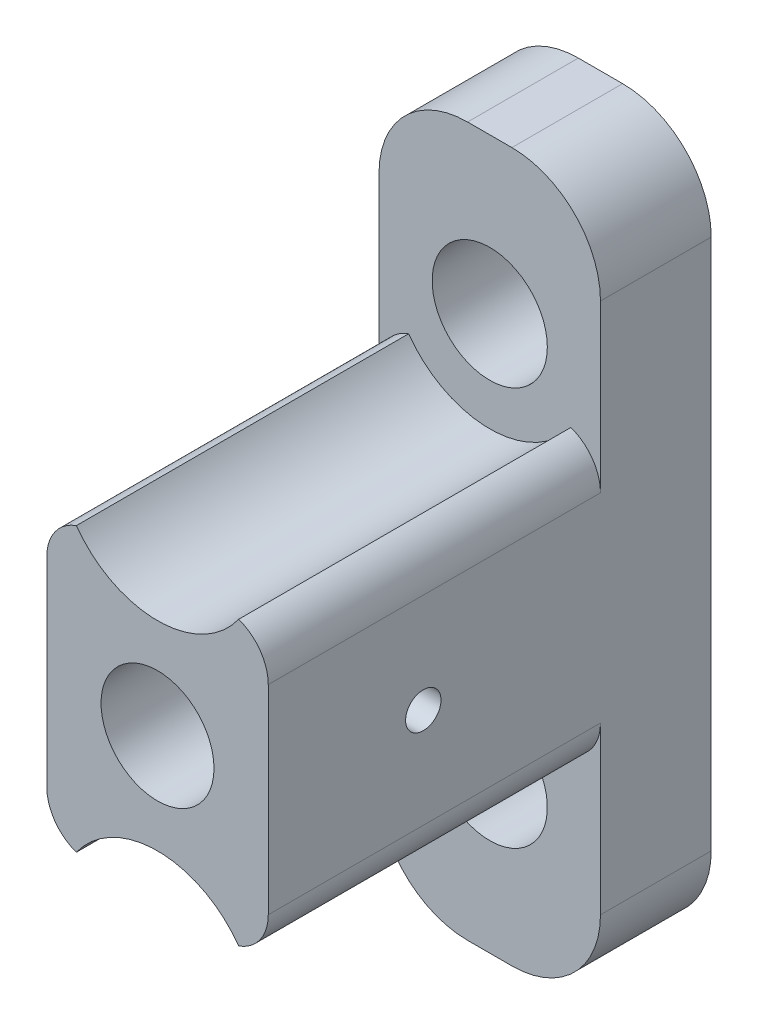
ISO-10303-21;
HEADER;
FILE_DESCRIPTION(('STEP AP214'),'2;1');
FILE_NAME('part.step','',(''),(''),'','','');
FILE_SCHEMA(('AUTOMOTIVE_DESIGN { 1 0 10303 214 1 1 1 1 }'));
ENDSEC;
DATA;
#1=APPLICATION_CONTEXT('core data for automotive mechanical design processes');
#2=APPLICATION_PROTOCOL_DEFINITION('international standard','automotive_design',2000,#1);
#3=PRODUCT_CONTEXT('',#1,'mechanical');
#4=PRODUCT('Part','Part','',(#3));
#5=PRODUCT_RELATED_PRODUCT_CATEGORY('part','',(#4));
#6=PRODUCT_DEFINITION_FORMATION('','',#4);
#7=PRODUCT_DEFINITION_CONTEXT('part definition',#1,'design');
#8=PRODUCT_DEFINITION('design','',#6,#7);
#9=PRODUCT_DEFINITION_SHAPE('','',#8);
#10=(LENGTH_UNIT() NAMED_UNIT(*) SI_UNIT(.MILLI.,.METRE.));
#11=(NAMED_UNIT(*) PLANE_ANGLE_UNIT() SI_UNIT($,.RADIAN.));
#12=(NAMED_UNIT(*) SI_UNIT($,.STERADIAN.) SOLID_ANGLE_UNIT());
#13=UNCERTAINTY_MEASURE_WITH_UNIT(LENGTH_MEASURE(1.E-05),#10,'distance_accuracy_value','');
#14=(GEOMETRIC_REPRESENTATION_CONTEXT(3) GLOBAL_UNCERTAINTY_ASSIGNED_CONTEXT((#13)) GLOBAL_UNIT_ASSIGNED_CONTEXT((#10,
#11,#12)) REPRESENTATION_CONTEXT('',''));
#15=CARTESIAN_POINT('',(0.,0.,0.));
#16=DIRECTION('',(0.,0.,1.));
#17=DIRECTION('',(1.,0.,0.));
#18=AXIS2_PLACEMENT_3D('',#15,#16,#17);
#19=CARTESIAN_POINT('',(-1.,12.,0.));
#20=DIRECTION('',(0.,0.,-1.));
#21=DIRECTION('',(-1.,0.,0.));
#22=AXIS2_PLACEMENT_3D('',#19,#20,#21);
#23=PLANE('',#22);
#24=CARTESIAN_POINT('',(3.00000000000001,-4.5,0.));
#25=DIRECTION('',(0.,0.,-1.));
#26=DIRECTION('',(-1.,0.,0.));
#27=AXIS2_PLACEMENT_3D('',#24,#25,#26);
#28=CIRCLE('',#27,2.);
#29=CARTESIAN_POINT('',(5.00000000000001,-4.5,0.));
#30=VERTEX_POINT('',#29);
#31=CARTESIAN_POINT('',(3.66345767685569,-6.38674956234824,0.));
#32=VERTEX_POINT('',#31);
#33=EDGE_CURVE('E193',#30,#32,#28,.T.);
#34=ORIENTED_EDGE('',*,*,#33,.T.);
#35=CARTESIAN_POINT('',(0.,-9.,0.));
#36=DIRECTION('',(0.,0.,-1.));
#37=DIRECTION('',(-1.,0.,0.));
#38=AXIS2_PLACEMENT_3D('',#35,#36,#37);
#39=CIRCLE('',#38,4.5);
#40=CARTESIAN_POINT('',(-3.66345767685568,-6.38674956234823,0.));
#41=VERTEX_POINT('',#40);
#42=EDGE_CURVE('E172',#32,#41,#39,.F.);
#43=ORIENTED_EDGE('',*,*,#42,.T.);
#44=CARTESIAN_POINT('',(-3.,-4.5,0.));
#45=DIRECTION('',(0.,0.,-1.));
#46=DIRECTION('',(-1.,0.,0.));
#47=AXIS2_PLACEMENT_3D('',#44,#45,#46);
#48=CIRCLE('',#47,2.);
#49=CARTESIAN_POINT('',(-5.,-4.5,0.));
#50=VERTEX_POINT('',#49);
#51=EDGE_CURVE('E196',#41,#50,#48,.T.);
#52=ORIENTED_EDGE('',*,*,#51,.T.);
#53=DIRECTION('',(0.,-1.,0.));
#54=VECTOR('',#53,1.);
#55=CARTESIAN_POINT('',(-5.,-12.,0.));
#56=LINE('',#55,#54);
#57=CARTESIAN_POINT('',(-5.,-12.,0.));
#58=VERTEX_POINT('',#57);
#59=EDGE_CURVE('E297',#50,#58,#56,.T.);
#60=ORIENTED_EDGE('',*,*,#59,.T.);
#61=CARTESIAN_POINT('',(-1.,-12.,0.));
#62=DIRECTION('',(0.,0.,1.));
#63=DIRECTION('',(1.,0.,0.));
#64=AXIS2_PLACEMENT_3D('',#61,#62,#63);
#65=CIRCLE('',#64,4.);
#66=CARTESIAN_POINT('',(-0.999999999999997,-16.,0.));
#67=VERTEX_POINT('',#66);
#68=EDGE_CURVE('E300',#58,#67,#65,.T.);
#69=ORIENTED_EDGE('',*,*,#68,.T.);
#70=DIRECTION('',(1.,0.,0.));
#71=VECTOR('',#70,1.);
#72=CARTESIAN_POINT('',(-0.999999999999997,-16.,0.));
#73=LINE('',#72,#71);
#74=CARTESIAN_POINT('',(1.,-16.,0.));
#75=VERTEX_POINT('',#74);
#76=EDGE_CURVE('E303',#67,#75,#73,.T.);
#77=ORIENTED_EDGE('',*,*,#76,.T.);
#78=CARTESIAN_POINT('',(1.00000000000001,-12.,0.));
#79=DIRECTION('',(0.,0.,1.));
#80=DIRECTION('',(-1.,0.,0.));
#81=AXIS2_PLACEMENT_3D('',#78,#79,#80);
#82=CIRCLE('',#81,4.);
#83=CARTESIAN_POINT('',(5.00000000000001,-12.,0.));
#84=VERTEX_POINT('',#83);
#85=EDGE_CURVE('E306',#75,#84,#82,.T.);
#86=ORIENTED_EDGE('',*,*,#85,.T.);
#87=DIRECTION('',(0.,1.,0.));
#88=VECTOR('',#87,1.);
#89=CARTESIAN_POINT('',(5.00000000000001,-12.,0.));
#90=LINE('',#89,#88);
#91=EDGE_CURVE('E310',#84,#30,#90,.T.);
#92=ORIENTED_EDGE('',*,*,#91,.T.);
#93=EDGE_LOOP('',(#34,#43,#52,#60,#69,#77,#86,#92));
#94=FACE_BOUND('',#93,.T.);
#95=CARTESIAN_POINT('',(0.,-9.,0.));
#96=DIRECTION('',(0.,0.,1.));
#97=DIRECTION('',(-1.,0.,0.));
#98=AXIS2_PLACEMENT_3D('',#95,#96,#97);
#99=CIRCLE('',#98,2.6);
#100=CARTESIAN_POINT('',(-2.6,-9.,0.));
#101=VERTEX_POINT('',#100);
#102=EDGE_CURVE('E265',#101,#101,#99,.T.);
#103=ORIENTED_EDGE('',*,*,#102,.F.);
#104=EDGE_LOOP('',(#103));
#105=FACE_BOUND('',#104,.T.);
#106=ADVANCED_FACE('F36',(#94,#105),#23,.F.);
#107=CARTESIAN_POINT('',(-1.,12.,-5.));
#108=DIRECTION('',(0.,0.,1.));
#109=DIRECTION('',(1.,0.,0.));
#110=AXIS2_PLACEMENT_3D('',#107,#108,#109);
#111=CYLINDRICAL_SURFACE('',#110,4.);
#112=CARTESIAN_POINT('',(-1.,12.,0.));
#113=DIRECTION('',(0.,0.,1.));
#114=DIRECTION('',(-1.,0.,0.));
#115=AXIS2_PLACEMENT_3D('',#112,#113,#114);
#116=CIRCLE('',#115,4.);
#117=CARTESIAN_POINT('',(-0.999999999999997,16.,0.));
#118=VERTEX_POINT('',#117);
#119=CARTESIAN_POINT('',(-5.,12.,0.));
#120=VERTEX_POINT('',#119);
#121=EDGE_CURVE('E262',#118,#120,#116,.T.);
#122=ORIENTED_EDGE('',*,*,#121,.F.);
#123=DIRECTION('',(0.,0.,1.));
#124=VECTOR('',#123,1.);
#125=CARTESIAN_POINT('',(-0.999999999999997,16.,-5.));
#126=LINE('',#125,#124);
#127=CARTESIAN_POINT('',(-0.999999999999997,16.,-5.));
#128=VERTEX_POINT('',#127);
#129=EDGE_CURVE('E317',#128,#118,#126,.T.);
#130=ORIENTED_EDGE('',*,*,#129,.F.);
#131=CARTESIAN_POINT('',(-1.,12.,-5.));
#132=DIRECTION('',(0.,0.,1.));
#133=DIRECTION('',(-1.,0.,0.));
#134=AXIS2_PLACEMENT_3D('',#131,#132,#133);
#135=CIRCLE('',#134,4.);
#136=CARTESIAN_POINT('',(-5.,12.,-5.));
#137=VERTEX_POINT('',#136);
#138=EDGE_CURVE('E269',#128,#137,#135,.T.);
#139=ORIENTED_EDGE('',*,*,#138,.T.);
#140=DIRECTION('',(0.,0.,1.));
#141=VECTOR('',#140,1.);
#142=CARTESIAN_POINT('',(-5.,12.,-5.));
#143=LINE('',#142,#141);
#144=EDGE_CURVE('E294',#137,#120,#143,.T.);
#145=ORIENTED_EDGE('',*,*,#144,.T.);
#146=EDGE_LOOP('',(#122,#130,#139,#145));
#147=FACE_BOUND('',#146,.T.);
#148=ADVANCED_FACE('F223',(#147),#111,.T.);
#149=CARTESIAN_POINT('',(-0.999999999999997,16.,-5.));
#150=DIRECTION('',(0.,1.,0.));
#151=DIRECTION('',(0.,0.,1.));
#152=AXIS2_PLACEMENT_3D('',#149,#150,#151);
#153=PLANE('',#152);
#154=DIRECTION('',(-1.,0.,0.));
#155=VECTOR('',#154,1.);
#156=CARTESIAN_POINT('',(-0.999999999999997,16.,0.));
#157=LINE('',#156,#155);
#158=CARTESIAN_POINT('',(1.,16.,0.));
#159=VERTEX_POINT('',#158);
#160=EDGE_CURVE('E273',#159,#118,#157,.T.);
#161=ORIENTED_EDGE('',*,*,#160,.F.);
#162=DIRECTION('',(0.,0.,1.));
#163=VECTOR('',#162,1.);
#164=CARTESIAN_POINT('',(1.,16.,-5.));
#165=LINE('',#164,#163);
#166=CARTESIAN_POINT('',(1.,16.,-5.));
#167=VERTEX_POINT('',#166);
#168=EDGE_CURVE('E319',#167,#159,#165,.T.);
#169=ORIENTED_EDGE('',*,*,#168,.F.);
#170=DIRECTION('',(-1.,0.,0.));
#171=VECTOR('',#170,1.);
#172=CARTESIAN_POINT('',(-0.999999999999997,16.,-5.));
#173=LINE('',#172,#171);
#174=EDGE_CURVE('E291',#167,#128,#173,.T.);
#175=ORIENTED_EDGE('',*,*,#174,.T.);
#176=ORIENTED_EDGE('',*,*,#129,.T.);
#177=EDGE_LOOP('',(#161,#169,#175,#176));
#178=FACE_BOUND('',#177,.T.);
#179=ADVANCED_FACE('F231',(#178),#153,.T.);
#180=CARTESIAN_POINT('',(1.,12.,-5.));
#181=DIRECTION('',(0.,0.,1.));
#182=DIRECTION('',(1.,0.,0.));
#183=AXIS2_PLACEMENT_3D('',#180,#181,#182);
#184=CYLINDRICAL_SURFACE('',#183,4.);
#185=CARTESIAN_POINT('',(1.,12.,0.));
#186=DIRECTION('',(0.,0.,1.));
#187=DIRECTION('',(1.,0.,0.));
#188=AXIS2_PLACEMENT_3D('',#185,#186,#187);
#189=CIRCLE('',#188,4.);
#190=CARTESIAN_POINT('',(5.00000000000001,12.,0.));
#191=VERTEX_POINT('',#190);
#192=EDGE_CURVE('E312',#191,#159,#189,.T.);
#193=ORIENTED_EDGE('',*,*,#192,.F.);
#194=DIRECTION('',(0.,0.,1.));
#195=VECTOR('',#194,1.);
#196=CARTESIAN_POINT('',(5.00000000000001,12.,-5.));
#197=LINE('',#196,#195);
#198=CARTESIAN_POINT('',(5.00000000000001,12.,-5.));
#199=VERTEX_POINT('',#198);
#200=EDGE_CURVE('E321',#199,#191,#197,.T.);
#201=ORIENTED_EDGE('',*,*,#200,.F.);
#202=CARTESIAN_POINT('',(1.,12.,-5.));
#203=DIRECTION('',(0.,0.,1.));
#204=DIRECTION('',(1.,0.,0.));
#205=AXIS2_PLACEMENT_3D('',#202,#203,#204);
#206=CIRCLE('',#205,4.);
#207=EDGE_CURVE('E288',#199,#167,#206,.T.);
#208=ORIENTED_EDGE('',*,*,#207,.T.);
#209=ORIENTED_EDGE('',*,*,#168,.T.);
#210=EDGE_LOOP('',(#193,#201,#208,#209));
#211=FACE_BOUND('',#210,.T.);
#212=ADVANCED_FACE('F383',(#211),#184,.T.);
#213=CARTESIAN_POINT('',(5.00000000000001,-12.,-5.));
#214=DIRECTION('',(1.,0.,0.));
#215=DIRECTION('',(0.,0.,-1.));
#216=AXIS2_PLACEMENT_3D('',#213,#214,#215);
#217=PLANE('',#216);
#218=CARTESIAN_POINT('',(5.00000000000001,0.,8.));
#219=DIRECTION('',(1.,0.,0.));
#220=DIRECTION('',(0.,0.,-1.));
#221=AXIS2_PLACEMENT_3D('',#218,#219,#220);
#222=CIRCLE('',#221,0.800000000000001);
#223=CARTESIAN_POINT('',(5.00000000000001,0.,7.2));
#224=VERTEX_POINT('',#223);
#225=EDGE_CURVE('E408',#224,#224,#222,.T.);
#226=ORIENTED_EDGE('',*,*,#225,.F.);
#227=EDGE_LOOP('',(#226));
#228=FACE_BOUND('',#227,.T.);
#229=DIRECTION('',(0.,1.,0.));
#230=VECTOR('',#229,1.);
#231=CARTESIAN_POINT('',(5.00000000000001,-6.5,15.));
#232=LINE('',#231,#230);
#233=CARTESIAN_POINT('',(5.00000000000001,-4.5,15.));
#234=VERTEX_POINT('',#233);
#235=CARTESIAN_POINT('',(5.00000000000001,4.5,15.));
#236=VERTEX_POINT('',#235);
#237=EDGE_CURVE('E338',#234,#236,#232,.T.);
#238=ORIENTED_EDGE('',*,*,#237,.F.);
#239=DIRECTION('',(0.,0.,-1.));
#240=VECTOR('',#239,1.);
#241=CARTESIAN_POINT('',(5.00000000000001,-4.5,0.));
#242=LINE('',#241,#240);
#243=EDGE_CURVE('E177',#234,#30,#242,.T.);
#244=ORIENTED_EDGE('',*,*,#243,.T.);
#245=ORIENTED_EDGE('',*,*,#91,.F.);
#246=DIRECTION('',(0.,0.,1.));
#247=VECTOR('',#246,1.);
#248=CARTESIAN_POINT('',(5.00000000000001,-12.,-5.));
#249=LINE('',#248,#247);
#250=CARTESIAN_POINT('',(5.00000000000001,-12.,-5.));
#251=VERTEX_POINT('',#250);
#252=EDGE_CURVE('E324',#251,#84,#249,.T.);
#253=ORIENTED_EDGE('',*,*,#252,.F.);
#254=DIRECTION('',(0.,1.,0.));
#255=VECTOR('',#254,1.);
#256=CARTESIAN_POINT('',(5.00000000000001,-12.,-5.));
#257=LINE('',#256,#255);
#258=EDGE_CURVE('E285',#251,#199,#257,.T.);
#259=ORIENTED_EDGE('',*,*,#258,.T.);
#260=ORIENTED_EDGE('',*,*,#200,.T.);
#261=CARTESIAN_POINT('',(5.00000000000001,4.5,0.));
#262=VERTEX_POINT('',#261);
#263=EDGE_CURVE('E309',#262,#191,#90,.T.);
#264=ORIENTED_EDGE('',*,*,#263,.F.);
#265=DIRECTION('',(0.,0.,-1.));
#266=VECTOR('',#265,1.);
#267=CARTESIAN_POINT('',(5.00000000000001,4.5,15.));
#268=LINE('',#267,#266);
#269=EDGE_CURVE('E182',#262,#236,#268,.F.);
#270=ORIENTED_EDGE('',*,*,#269,.T.);
#271=EDGE_LOOP('',(#238,#244,#245,#253,#259,#260,#264,#270));
#272=FACE_BOUND('',#271,.T.);
#273=ADVANCED_FACE('F337',(#228,#272),#217,.T.);
#274=CARTESIAN_POINT('',(1.00000000000001,-12.,-5.));
#275=DIRECTION('',(0.,0.,1.));
#276=DIRECTION('',(1.,0.,0.));
#277=AXIS2_PLACEMENT_3D('',#274,#275,#276);
#278=CYLINDRICAL_SURFACE('',#277,4.);
#279=ORIENTED_EDGE('',*,*,#85,.F.);
#280=DIRECTION('',(0.,0.,1.));
#281=VECTOR('',#280,1.);
#282=CARTESIAN_POINT('',(1.,-16.,-5.));
#283=LINE('',#282,#281);
#284=CARTESIAN_POINT('',(1.,-16.,-5.));
#285=VERTEX_POINT('',#284);
#286=EDGE_CURVE('E326',#285,#75,#283,.T.);
#287=ORIENTED_EDGE('',*,*,#286,.F.);
#288=CARTESIAN_POINT('',(1.00000000000001,-12.,-5.));
#289=DIRECTION('',(0.,0.,1.));
#290=DIRECTION('',(-1.,0.,0.));
#291=AXIS2_PLACEMENT_3D('',#288,#289,#290);
#292=CIRCLE('',#291,4.);
#293=EDGE_CURVE('E282',#285,#251,#292,.T.);
#294=ORIENTED_EDGE('',*,*,#293,.T.);
#295=ORIENTED_EDGE('',*,*,#252,.T.);
#296=EDGE_LOOP('',(#279,#287,#294,#295));
#297=FACE_BOUND('',#296,.T.);
#298=ADVANCED_FACE('F389',(#297),#278,.T.);
#299=CARTESIAN_POINT('',(-0.999999999999997,-16.,-5.));
#300=DIRECTION('',(0.,-1.,0.));
#301=DIRECTION('',(0.,0.,-1.));
#302=AXIS2_PLACEMENT_3D('',#299,#300,#301);
#303=PLANE('',#302);
#304=ORIENTED_EDGE('',*,*,#76,.F.);
#305=DIRECTION('',(0.,0.,1.));
#306=VECTOR('',#305,1.);
#307=CARTESIAN_POINT('',(-0.999999999999997,-16.,-5.));
#308=LINE('',#307,#306);
#309=CARTESIAN_POINT('',(-0.999999999999997,-16.,-5.));
#310=VERTEX_POINT('',#309);
#311=EDGE_CURVE('E328',#310,#67,#308,.T.);
#312=ORIENTED_EDGE('',*,*,#311,.F.);
#313=DIRECTION('',(1.,0.,0.));
#314=VECTOR('',#313,1.);
#315=CARTESIAN_POINT('',(-0.999999999999997,-16.,-5.));
#316=LINE('',#315,#314);
#317=EDGE_CURVE('E279',#310,#285,#316,.T.);
#318=ORIENTED_EDGE('',*,*,#317,.T.);
#319=ORIENTED_EDGE('',*,*,#286,.T.);
#320=EDGE_LOOP('',(#304,#312,#318,#319));
#321=FACE_BOUND('',#320,.T.);
#322=ADVANCED_FACE('F393',(#321),#303,.T.);
#323=CARTESIAN_POINT('',(-1.,-12.,-5.));
#324=DIRECTION('',(0.,0.,1.));
#325=DIRECTION('',(1.,0.,0.));
#326=AXIS2_PLACEMENT_3D('',#323,#324,#325);
#327=CYLINDRICAL_SURFACE('',#326,4.);
#328=ORIENTED_EDGE('',*,*,#68,.F.);
#329=DIRECTION('',(0.,0.,1.));
#330=VECTOR('',#329,1.);
#331=CARTESIAN_POINT('',(-5.,-12.,-5.));
#332=LINE('',#331,#330);
#333=CARTESIAN_POINT('',(-5.,-12.,-5.));
#334=VERTEX_POINT('',#333);
#335=EDGE_CURVE('E330',#334,#58,#332,.T.);
#336=ORIENTED_EDGE('',*,*,#335,.F.);
#337=CARTESIAN_POINT('',(-1.,-12.,-5.));
#338=DIRECTION('',(0.,0.,1.));
#339=DIRECTION('',(1.,0.,0.));
#340=AXIS2_PLACEMENT_3D('',#337,#338,#339);
#341=CIRCLE('',#340,4.);
#342=EDGE_CURVE('E276',#334,#310,#341,.T.);
#343=ORIENTED_EDGE('',*,*,#342,.T.);
#344=ORIENTED_EDGE('',*,*,#311,.T.);
#345=EDGE_LOOP('',(#328,#336,#343,#344));
#346=FACE_BOUND('',#345,.T.);
#347=ADVANCED_FACE('F396',(#346),#327,.T.);
#348=CARTESIAN_POINT('',(-5.,-12.,-5.));
#349=DIRECTION('',(-1.,0.,0.));
#350=DIRECTION('',(0.,0.,1.));
#351=AXIS2_PLACEMENT_3D('',#348,#349,#350);
#352=PLANE('',#351);
#353=CARTESIAN_POINT('',(-5.00000000000001,0.,8.));
#354=DIRECTION('',(1.,0.,0.));
#355=DIRECTION('',(0.,0.,-1.));
#356=AXIS2_PLACEMENT_3D('',#353,#354,#355);
#357=CIRCLE('',#356,0.800000000000001);
#358=CARTESIAN_POINT('',(-5.00000000000001,0.,7.2));
#359=VERTEX_POINT('',#358);
#360=EDGE_CURVE('E205',#359,#359,#357,.T.);
#361=ORIENTED_EDGE('',*,*,#360,.T.);
#362=EDGE_LOOP('',(#361));
#363=FACE_BOUND('',#362,.T.);
#364=ORIENTED_EDGE('',*,*,#59,.F.);
#365=DIRECTION('',(0.,0.,-1.));
#366=VECTOR('',#365,1.);
#367=CARTESIAN_POINT('',(-5.,-4.5,15.));
#368=LINE('',#367,#366);
#369=CARTESIAN_POINT('',(-5.00000000000001,-4.5,15.));
#370=VERTEX_POINT('',#369);
#371=EDGE_CURVE('E191',#50,#370,#368,.F.);
#372=ORIENTED_EDGE('',*,*,#371,.T.);
#373=DIRECTION('',(0.,-1.,0.));
#374=VECTOR('',#373,1.);
#375=CARTESIAN_POINT('',(-5.00000000000001,-6.5,15.));
#376=LINE('',#375,#374);
#377=CARTESIAN_POINT('',(-5.00000000000001,4.5,15.));
#378=VERTEX_POINT('',#377);
#379=EDGE_CURVE('E343',#378,#370,#376,.T.);
#380=ORIENTED_EDGE('',*,*,#379,.F.);
#381=DIRECTION('',(0.,0.,-1.));
#382=VECTOR('',#381,1.);
#383=CARTESIAN_POINT('',(-5.,4.5,0.));
#384=LINE('',#383,#382);
#385=CARTESIAN_POINT('',(-5.,4.5,0.));
#386=VERTEX_POINT('',#385);
#387=EDGE_CURVE('E176',#378,#386,#384,.T.);
#388=ORIENTED_EDGE('',*,*,#387,.T.);
#389=EDGE_CURVE('E298',#120,#386,#56,.T.);
#390=ORIENTED_EDGE('',*,*,#389,.F.);
#391=ORIENTED_EDGE('',*,*,#144,.F.);
#392=DIRECTION('',(0.,-1.,0.));
#393=VECTOR('',#392,1.);
#394=CARTESIAN_POINT('',(-5.,-12.,-5.));
#395=LINE('',#394,#393);
#396=EDGE_CURVE('E272',#137,#334,#395,.T.);
#397=ORIENTED_EDGE('',*,*,#396,.T.);
#398=ORIENTED_EDGE('',*,*,#335,.T.);
#399=EDGE_LOOP('',(#364,#372,#380,#388,#390,#391,#397,#398));
#400=FACE_BOUND('',#399,.T.);
#401=ADVANCED_FACE('F251',(#363,#400),#352,.T.);
#402=CARTESIAN_POINT('',(-1.,12.,-5.));
#403=DIRECTION('',(0.,0.,-1.));
#404=DIRECTION('',(-1.,0.,0.));
#405=AXIS2_PLACEMENT_3D('',#402,#403,#404);
#406=PLANE('',#405);
#407=CARTESIAN_POINT('',(0.,-9.,-5.));
#408=DIRECTION('',(0.,0.,1.));
#409=DIRECTION('',(-1.,0.,0.));
#410=AXIS2_PLACEMENT_3D('',#407,#408,#409);
#411=CIRCLE('',#410,2.6);
#412=CARTESIAN_POINT('',(-2.6,-9.,-5.));
#413=VERTEX_POINT('',#412);
#414=EDGE_CURVE('E259',#413,#413,#411,.T.);
#415=ORIENTED_EDGE('',*,*,#414,.T.);
#416=EDGE_LOOP('',(#415));
#417=FACE_BOUND('',#416,.T.);
#418=CARTESIAN_POINT('',(0.,9.,-5.));
#419=DIRECTION('',(0.,0.,1.));
#420=DIRECTION('',(1.,0.,0.));
#421=AXIS2_PLACEMENT_3D('',#418,#419,#420);
#422=CIRCLE('',#421,2.6);
#423=CARTESIAN_POINT('',(2.6,9.,-5.));
#424=VERTEX_POINT('',#423);
#425=EDGE_CURVE('E258',#424,#424,#422,.T.);
#426=ORIENTED_EDGE('',*,*,#425,.T.);
#427=EDGE_LOOP('',(#426));
#428=FACE_BOUND('',#427,.T.);
#429=ORIENTED_EDGE('',*,*,#138,.F.);
#430=ORIENTED_EDGE('',*,*,#174,.F.);
#431=ORIENTED_EDGE('',*,*,#207,.F.);
#432=ORIENTED_EDGE('',*,*,#258,.F.);
#433=ORIENTED_EDGE('',*,*,#293,.F.);
#434=ORIENTED_EDGE('',*,*,#317,.F.);
#435=ORIENTED_EDGE('',*,*,#342,.F.);
#436=ORIENTED_EDGE('',*,*,#396,.F.);
#437=EDGE_LOOP('',(#429,#430,#431,#432,#433,#434,#435,#436));
#438=FACE_BOUND('',#437,.T.);
#439=ADVANCED_FACE('F242',(#417,#428,#438),#406,.T.);
#440=CARTESIAN_POINT('',(-3.,4.5,0.));
#441=DIRECTION('',(0.,0.,-1.));
#442=DIRECTION('',(-1.,0.,0.));
#443=AXIS2_PLACEMENT_3D('',#440,#441,#442);
#444=CIRCLE('',#443,2.);
#445=CARTESIAN_POINT('',(-3.66345767685569,6.38674956234824,0.));
#446=VERTEX_POINT('',#445);
#447=EDGE_CURVE('E160',#386,#446,#444,.T.);
#448=ORIENTED_EDGE('',*,*,#447,.T.);
#449=CARTESIAN_POINT('',(0.,9.,0.));
#450=DIRECTION('',(0.,0.,-1.));
#451=DIRECTION('',(-1.,0.,0.));
#452=AXIS2_PLACEMENT_3D('',#449,#450,#451);
#453=CIRCLE('',#452,4.5);
#454=CARTESIAN_POINT('',(3.66345767685569,6.38674956234824,0.));
#455=VERTEX_POINT('',#454);
#456=EDGE_CURVE('E65',#446,#455,#453,.F.);
#457=ORIENTED_EDGE('',*,*,#456,.T.);
#458=CARTESIAN_POINT('',(3.00000000000001,4.5,0.));
#459=DIRECTION('',(0.,0.,-1.));
#460=DIRECTION('',(-1.,0.,0.));
#461=AXIS2_PLACEMENT_3D('',#458,#459,#460);
#462=CIRCLE('',#461,2.);
#463=EDGE_CURVE('E198',#455,#262,#462,.T.);
#464=ORIENTED_EDGE('',*,*,#463,.T.);
#465=ORIENTED_EDGE('',*,*,#263,.T.);
#466=ORIENTED_EDGE('',*,*,#192,.T.);
#467=ORIENTED_EDGE('',*,*,#160,.T.);
#468=ORIENTED_EDGE('',*,*,#121,.T.);
#469=ORIENTED_EDGE('',*,*,#389,.T.);
#470=EDGE_LOOP('',(#448,#457,#464,#465,#466,#467,#468,#469));
#471=FACE_BOUND('',#470,.T.);
#472=CARTESIAN_POINT('',(0.,9.,0.));
#473=DIRECTION('',(0.,0.,1.));
#474=DIRECTION('',(1.,0.,0.));
#475=AXIS2_PLACEMENT_3D('',#472,#473,#474);
#476=CIRCLE('',#475,2.6);
#477=CARTESIAN_POINT('',(2.6,9.,0.));
#478=VERTEX_POINT('',#477);
#479=EDGE_CURVE('E256',#478,#478,#476,.T.);
#480=ORIENTED_EDGE('',*,*,#479,.F.);
#481=EDGE_LOOP('',(#480));
#482=FACE_BOUND('',#481,.T.);
#483=ADVANCED_FACE('F227',(#471,#482),#23,.F.);
#484=CARTESIAN_POINT('',(0.,9.,-5.));
#485=DIRECTION('',(0.,0.,1.));
#486=DIRECTION('',(1.,0.,0.));
#487=AXIS2_PLACEMENT_3D('',#484,#485,#486);
#488=CYLINDRICAL_SURFACE('',#487,2.6);
#489=ORIENTED_EDGE('',*,*,#425,.F.);
#490=EDGE_LOOP('',(#489));
#491=FACE_BOUND('',#490,.T.);
#492=ORIENTED_EDGE('',*,*,#479,.T.);
#493=EDGE_LOOP('',(#492));
#494=FACE_BOUND('',#493,.T.);
#495=ADVANCED_FACE('F241',(#491,#494),#488,.F.);
#496=CARTESIAN_POINT('',(0.,-9.,-5.));
#497=DIRECTION('',(0.,0.,1.));
#498=DIRECTION('',(1.,0.,0.));
#499=AXIS2_PLACEMENT_3D('',#496,#497,#498);
#500=CYLINDRICAL_SURFACE('',#499,2.6);
#501=ORIENTED_EDGE('',*,*,#414,.F.);
#502=EDGE_LOOP('',(#501));
#503=FACE_BOUND('',#502,.T.);
#504=ORIENTED_EDGE('',*,*,#102,.T.);
#505=EDGE_LOOP('',(#504));
#506=FACE_BOUND('',#505,.T.);
#507=ADVANCED_FACE('F248',(#503,#506),#500,.F.);
#508=CARTESIAN_POINT('',(0.,0.,15.));
#509=DIRECTION('',(0.,0.,-1.));
#510=DIRECTION('',(-1.,0.,0.));
#511=AXIS2_PLACEMENT_3D('',#508,#509,#510);
#512=PLANE('',#511);
#513=CARTESIAN_POINT('',(3.00000000000001,4.5,15.));
#514=DIRECTION('',(0.,0.,-1.));
#515=DIRECTION('',(-1.,0.,0.));
#516=AXIS2_PLACEMENT_3D('',#513,#514,#515);
#517=CIRCLE('',#516,2.);
#518=CARTESIAN_POINT('',(3.66345767685569,6.38674956234824,15.));
#519=VERTEX_POINT('',#518);
#520=EDGE_CURVE('E171',#236,#519,#517,.F.);
#521=ORIENTED_EDGE('',*,*,#520,.T.);
#522=CARTESIAN_POINT('',(0.,9.,15.));
#523=DIRECTION('',(0.,0.,1.));
#524=DIRECTION('',(1.,0.,0.));
#525=AXIS2_PLACEMENT_3D('',#522,#523,#524);
#526=CIRCLE('',#525,4.5);
#527=CARTESIAN_POINT('',(-3.66345767685569,6.38674956234824,15.));
#528=VERTEX_POINT('',#527);
#529=EDGE_CURVE('E154',#528,#519,#526,.T.);
#530=ORIENTED_EDGE('',*,*,#529,.F.);
#531=CARTESIAN_POINT('',(-3.,4.5,15.));
#532=DIRECTION('',(0.,0.,-1.));
#533=DIRECTION('',(-1.,0.,0.));
#534=AXIS2_PLACEMENT_3D('',#531,#532,#533);
#535=CIRCLE('',#534,2.);
#536=EDGE_CURVE('E167',#528,#378,#535,.F.);
#537=ORIENTED_EDGE('',*,*,#536,.T.);
#538=ORIENTED_EDGE('',*,*,#379,.T.);
#539=CARTESIAN_POINT('',(-3.,-4.5,15.));
#540=DIRECTION('',(0.,0.,-1.));
#541=DIRECTION('',(-1.,0.,0.));
#542=AXIS2_PLACEMENT_3D('',#539,#540,#541);
#543=CIRCLE('',#542,2.);
#544=CARTESIAN_POINT('',(-3.66345767685569,-6.38674956234823,15.));
#545=VERTEX_POINT('',#544);
#546=EDGE_CURVE('E179',#370,#545,#543,.F.);
#547=ORIENTED_EDGE('',*,*,#546,.T.);
#548=CARTESIAN_POINT('',(0.,-9.,15.));
#549=DIRECTION('',(0.,0.,1.));
#550=DIRECTION('',(-1.,0.,0.));
#551=AXIS2_PLACEMENT_3D('',#548,#549,#550);
#552=CIRCLE('',#551,4.5);
#553=CARTESIAN_POINT('',(3.66345767685569,-6.38674956234824,15.));
#554=VERTEX_POINT('',#553);
#555=EDGE_CURVE('E57',#554,#545,#552,.T.);
#556=ORIENTED_EDGE('',*,*,#555,.F.);
#557=CARTESIAN_POINT('',(3.00000000000001,-4.5,15.));
#558=DIRECTION('',(0.,0.,-1.));
#559=DIRECTION('',(-1.,0.,0.));
#560=AXIS2_PLACEMENT_3D('',#557,#558,#559);
#561=CIRCLE('',#560,2.);
#562=EDGE_CURVE('E188',#554,#234,#561,.F.);
#563=ORIENTED_EDGE('',*,*,#562,.T.);
#564=ORIENTED_EDGE('',*,*,#237,.T.);
#565=EDGE_LOOP('',(#521,#530,#537,#538,#547,#556,#563,#564));
#566=FACE_BOUND('',#565,.T.);
#567=CARTESIAN_POINT('',(0.,0.,15.));
#568=DIRECTION('',(0.,0.,1.));
#569=DIRECTION('',(1.,0.,0.));
#570=AXIS2_PLACEMENT_3D('',#567,#568,#569);
#571=CIRCLE('',#570,2.55);
#572=CARTESIAN_POINT('',(2.55,0.,15.));
#573=VERTEX_POINT('',#572);
#574=EDGE_CURVE('E344',#573,#573,#571,.T.);
#575=ORIENTED_EDGE('',*,*,#574,.F.);
#576=EDGE_LOOP('',(#575));
#577=FACE_BOUND('',#576,.T.);
#578=ADVANCED_FACE('F164',(#566,#577),#512,.F.);
#579=CARTESIAN_POINT('',(0.,0.,15.));
#580=DIRECTION('',(0.,0.,-1.));
#581=DIRECTION('',(-1.,0.,0.));
#582=AXIS2_PLACEMENT_3D('',#579,#580,#581);
#583=CYLINDRICAL_SURFACE('',#582,2.55);
#584=CARTESIAN_POINT('',(-2.55,0.,8.8));
#585=CARTESIAN_POINT('',(-2.5499997989327,-0.043792464481311,8.79999974011081));
#586=CARTESIAN_POINT('',(-2.54886125970054,-0.0875876857051798,8.79639232197433));
#587=CARTESIAN_POINT('',(-2.54443098036113,-0.173896842158941,8.7820961455426));
#588=CARTESIAN_POINT('',(-2.54113876821869,-0.216410494361227,8.77140583483481));
#589=CARTESIAN_POINT('',(-2.53276068361256,-0.29889946278752,8.74334023334086));
#590=CARTESIAN_POINT('',(-2.52767760138796,-0.338878614169557,8.72597533798701));
#591=CARTESIAN_POINT('',(-2.51624226572055,-0.415357671746864,8.68509787957505));
#592=CARTESIAN_POINT('',(-2.50988980930253,-0.451857020134869,8.66158433315073));
#593=CARTESIAN_POINT('',(-2.49636871295429,-0.521475728514561,8.60830732614732));
#594=CARTESIAN_POINT('',(-2.48918218773599,-0.554471686300546,8.57838716889782));
#595=CARTESIAN_POINT('',(-2.47490621217211,-0.615069402634103,8.51347987497106));
#596=CARTESIAN_POINT('',(-2.46781678031169,-0.642670146931653,8.47849178771826));
#597=CARTESIAN_POINT('',(-2.45434549143357,-0.692365085038927,8.40337108197384));
#598=CARTESIAN_POINT('',(-2.44798569337928,-0.714304762184557,8.36313191391878));
#599=CARTESIAN_POINT('',(-2.43696292366353,-0.751054241844615,8.27930328908789));
#600=CARTESIAN_POINT('',(-2.43229950110726,-0.765865939306999,8.23571472631408));
#601=CARTESIAN_POINT('',(-2.42538464580072,-0.787486812382559,8.14781777778655));
#602=CARTESIAN_POINT('',(-2.42306436041258,-0.794525035397851,8.10357130109242));
#603=CARTESIAN_POINT('',(-2.42089410525271,-0.8011147737106,8.01446937072792));
#604=CARTESIAN_POINT('',(-2.4210434728158,-0.800668297326124,7.96961408364309));
#605=CARTESIAN_POINT('',(-2.42373489853379,-0.792480381726962,7.88246578853613));
#606=CARTESIAN_POINT('',(-2.42618130866491,-0.785030545125256,7.84014193108353));
#607=CARTESIAN_POINT('',(-2.43303572238802,-0.763520341755475,7.75737806834172));
#608=CARTESIAN_POINT('',(-2.43744393594648,-0.749459267395623,7.7169382652096));
#609=CARTESIAN_POINT('',(-2.44779826976624,-0.714920672029705,7.63839763676621));
#610=CARTESIAN_POINT('',(-2.45376604072639,-0.694351884590424,7.6003399231492));
#611=CARTESIAN_POINT('',(-2.46655720121429,-0.647445117323589,7.52812074544747));
#612=CARTESIAN_POINT('',(-2.47338081426798,-0.621105628976963,7.4939603037062));
#613=CARTESIAN_POINT('',(-2.48749809934453,-0.561975976964743,7.42885737107684));
#614=CARTESIAN_POINT('',(-2.49479897090689,-0.528945216737059,7.39813455820315));
#615=CARTESIAN_POINT('',(-2.50877203788267,-0.458109573956179,7.34261056681011));
#616=CARTESIAN_POINT('',(-2.51544418596347,-0.420304332462972,7.31780983391156));
#617=CARTESIAN_POINT('',(-2.52747904774194,-0.340567091795651,7.2746835799284));
#618=CARTESIAN_POINT('',(-2.53283098751243,-0.298604818269271,7.25641082386224));
#619=CARTESIAN_POINT('',(-2.54154461925304,-0.211995028911295,7.22724891188516));
#620=CARTESIAN_POINT('',(-2.54490692045828,-0.167348339675959,7.21635749563048));
#621=CARTESIAN_POINT('',(-2.54916423550347,-0.0785014733767733,7.20264249801255));
#622=CARTESIAN_POINT('',(-2.55015013913279,-0.0343514870512815,7.1995215582871));
#623=CARTESIAN_POINT('',(-2.54981260116716,0.0538463020165664,7.20059721100517));
#624=CARTESIAN_POINT('',(-2.54848949986966,0.0978941188585108,7.20479272516136));
#625=CARTESIAN_POINT('',(-2.54374235842705,0.18348778801536,7.2201436586141));
#626=CARTESIAN_POINT('',(-2.54037186112744,0.225068685811057,7.23112182142597));
#627=CARTESIAN_POINT('',(-2.53192474040008,0.305786460844813,7.25950982941561));
#628=CARTESIAN_POINT('',(-2.52684790577675,0.344923034834369,7.27692047077604));
#629=CARTESIAN_POINT('',(-2.5153550270692,0.420707755465562,7.31815583195796));
#630=CARTESIAN_POINT('',(-2.50890922152233,0.45727145117825,7.34212723678914));
#631=CARTESIAN_POINT('',(-2.49541511990848,0.525956847345014,7.39562789254141));
#632=CARTESIAN_POINT('',(-2.4883666595082,0.558077329922705,7.42515866205797));
#633=CARTESIAN_POINT('',(-2.47410703295863,0.618296942708279,7.4903384338089));
#634=CARTESIAN_POINT('',(-2.46690061866338,0.646184112944069,7.52618475254766));
#635=CARTESIAN_POINT('',(-2.45343521498235,0.695566715024036,7.60220483238239));
#636=CARTESIAN_POINT('',(-2.44717621165964,0.717062240897303,7.64237852980537));
#637=CARTESIAN_POINT('',(-2.43638335564519,0.752919371455891,7.72583503823488));
#638=CARTESIAN_POINT('',(-2.43184299304472,0.767307960451277,7.7691053634515));
#639=CARTESIAN_POINT('',(-2.4250417183109,0.788542582466859,7.85762651646921));
#640=CARTESIAN_POINT('',(-2.4227799299929,0.795391514820084,7.90287657600967));
#641=CARTESIAN_POINT('',(-2.42088367938249,0.801143144474987,7.99185549180113));
#642=CARTESIAN_POINT('',(-2.42113416755473,0.800393787030436,8.0355596812694));
#643=CARTESIAN_POINT('',(-2.42395447283963,0.791810998190976,8.12218670361315));
#644=CARTESIAN_POINT('',(-2.42652418015934,0.783977902143664,8.16510957337855));
#645=CARTESIAN_POINT('',(-2.4336126802503,0.761683700665777,8.24832796409741));
#646=CARTESIAN_POINT('',(-2.43810191533309,0.747322908059999,8.28865306714495));
#647=CARTESIAN_POINT('',(-2.4485158978744,0.712460071804365,8.36635353745671));
#648=CARTESIAN_POINT('',(-2.45444093893312,0.691956771903528,8.40372829934666));
#649=CARTESIAN_POINT('',(-2.46735008252348,0.644446576800419,8.47606081199848));
#650=CARTESIAN_POINT('',(-2.47436670663573,0.617215331542676,8.51086538264471));
#651=CARTESIAN_POINT('',(-2.48851964616352,0.557416120630678,8.57552356793274));
#652=CARTESIAN_POINT('',(-2.49565599323161,0.524846723053248,8.60537584982149));
#653=CARTESIAN_POINT('',(-2.50952684953623,0.454002575043665,8.66026869987101));
#654=CARTESIAN_POINT('',(-2.51624032402257,0.415575005369269,8.68511795198813));
#655=CARTESIAN_POINT('',(-2.52824388622385,0.33487756230722,8.72797119771221));
#656=CARTESIAN_POINT('',(-2.53353452241789,0.292609177916575,8.74597783013723));
#657=CARTESIAN_POINT('',(-2.54173691745558,0.20902082370163,8.77335803680282));
#658=CARTESIAN_POINT('',(-2.54480853407998,0.167908741721517,8.78331981372454));
#659=CARTESIAN_POINT('',(-2.548939965021,0.084531802869566,8.79664024013252));
#660=CARTESIAN_POINT('',(-2.55000019406418,0.0422671854616212,8.80000025083732));
#661=CARTESIAN_POINT('',(-2.55,0.,8.8));
#662=B_SPLINE_CURVE_WITH_KNOTS('',3,(#584,#585,#586,#587,#588,#589,#590,#591,#592,#593,#594,
#595,#596,#597,#598,#599,#600,#601,#602,#603,#604,#605,#606,#607,#608,#609,#610,#611,#612,#613,
#614,#615,#616,#617,#618,#619,#620,#621,#622,#623,#624,#625,#626,#627,#628,#629,#630,#631,#632,
#633,#634,#635,#636,#637,#638,#639,#640,#641,#642,#643,#644,#645,#646,#647,#648,#649,#650,#651,
#652,#653,#654,#655,#656,#657,#658,#659,#660,#661),.UNSPECIFIED.,.T.,.F.,(4,2,2,2,2,2,2,2,2,2,2,
2,2,2,2,2,2,2,2,2,2,2,2,2,2,2,2,2,2,2,2,2,2,2,2,2,2,2,4),(0.,0.131222022669239,
0.262472815806435,0.393520013339382,0.524588182348153,0.659329812654161,0.794096748825869,
0.932225076494333,1.07031666292669,1.20422078047184,1.33808896901856,1.46661905277742,
1.59516289606869,1.72559597251455,1.85606318624375,1.99251893768833,2.12898495383292,
2.26653030405739,2.40403351553339,2.53618784094413,2.6683226913064,2.79714243758889,
2.9259781339326,3.05797009226883,3.18999815796768,3.32730159811379,3.4646030182545,
3.60137903283399,3.73810243256508,3.86859426419695,3.99907991860606,4.12762482731028,
4.25619604368141,4.38983130638325,4.52350247468288,4.66158519273691,4.79961460578992,
4.92629232534801,5.05294392247785),.UNSPECIFIED.);
#663=CARTESIAN_POINT('',(-2.55,0.,8.8));
#664=VERTEX_POINT('',#663);
#665=EDGE_CURVE('E40',#664,#664,#662,.T.);
#666=ORIENTED_EDGE('',*,*,#665,.F.);
#667=EDGE_LOOP('',(#666));
#668=FACE_BOUND('',#667,.T.);
#669=CARTESIAN_POINT('',(2.55,0.,7.2));
#670=CARTESIAN_POINT('',(2.5499997989327,-0.043792464481311,7.20000025988918));
#671=CARTESIAN_POINT('',(2.54886125970054,-0.0875876857051797,7.20360767802567));
#672=CARTESIAN_POINT('',(2.54443098036113,-0.173896842158941,7.2179038544574));
#673=CARTESIAN_POINT('',(2.54113876821869,-0.216410494361227,7.22859416516519));
#674=CARTESIAN_POINT('',(2.53276068361256,-0.29889946278752,7.25665976665914));
#675=CARTESIAN_POINT('',(2.52767760138796,-0.338878614169557,7.27402466201299));
#676=CARTESIAN_POINT('',(2.51624226572055,-0.415357671746864,7.31490212042495));
#677=CARTESIAN_POINT('',(2.50988980930253,-0.451857020134869,7.33841566684927));
#678=CARTESIAN_POINT('',(2.49636871295429,-0.521475728514561,7.39169267385268));
#679=CARTESIAN_POINT('',(2.48918218773599,-0.554471686300546,7.42161283110218));
#680=CARTESIAN_POINT('',(2.47490621217211,-0.615069402634102,7.48652012502894));
#681=CARTESIAN_POINT('',(2.46781678031169,-0.642670146931652,7.52150821228174));
#682=CARTESIAN_POINT('',(2.45434549143357,-0.692365085038926,7.59662891802616));
#683=CARTESIAN_POINT('',(2.44798569337928,-0.714304762184557,7.63686808608122));
#684=CARTESIAN_POINT('',(2.43696292366353,-0.751054241844615,7.72069671091211));
#685=CARTESIAN_POINT('',(2.43229950110726,-0.765865939306999,7.76428527368592));
#686=CARTESIAN_POINT('',(2.42538464580072,-0.78748681238256,7.85218222221345));
#687=CARTESIAN_POINT('',(2.42306436041258,-0.794525035397851,7.89642869890759));
#688=CARTESIAN_POINT('',(2.42089410525271,-0.8011147737106,7.98553062927208));
#689=CARTESIAN_POINT('',(2.4210434728158,-0.800668297326123,8.03038591635691));
#690=CARTESIAN_POINT('',(2.42373489853379,-0.792480381726962,8.11753421146387));
#691=CARTESIAN_POINT('',(2.42618130866491,-0.785030545125256,8.15985806891647));
#692=CARTESIAN_POINT('',(2.43303572238802,-0.763520341755476,8.24262193165828));
#693=CARTESIAN_POINT('',(2.43744393594648,-0.749459267395623,8.2830617347904));
#694=CARTESIAN_POINT('',(2.44779826976624,-0.714920672029706,8.36160236323379));
#695=CARTESIAN_POINT('',(2.45376604072639,-0.694351884590425,8.3996600768508));
#696=CARTESIAN_POINT('',(2.46655720121429,-0.64744511732359,8.47187925455253));
#697=CARTESIAN_POINT('',(2.47338081426797,-0.621105628976964,8.5060396962938));
#698=CARTESIAN_POINT('',(2.48749809934453,-0.561975976964744,8.57114262892316));
#699=CARTESIAN_POINT('',(2.49479897090689,-0.52894521673706,8.60186544179685));
#700=CARTESIAN_POINT('',(2.50877203788267,-0.458109573956179,8.65738943318989));
#701=CARTESIAN_POINT('',(2.51544418596347,-0.420304332462973,8.68219016608844));
#702=CARTESIAN_POINT('',(2.52747904774194,-0.340567091795651,8.7253164200716));
#703=CARTESIAN_POINT('',(2.53283098751243,-0.298604818269271,8.74358917613776));
#704=CARTESIAN_POINT('',(2.54154461925304,-0.211995028911296,8.77275108811484));
#705=CARTESIAN_POINT('',(2.54490692045828,-0.16734833967596,8.78364250436952));
#706=CARTESIAN_POINT('',(2.54916423550347,-0.0785014733767734,8.79735750198745));
#707=CARTESIAN_POINT('',(2.55015013913279,-0.0343514870512815,8.8004784417129));
#708=CARTESIAN_POINT('',(2.54981260116716,0.0538463020165665,8.79940278899483));
#709=CARTESIAN_POINT('',(2.54848949986966,0.0978941188585109,8.79520727483864));
#710=CARTESIAN_POINT('',(2.54374235842705,0.18348778801536,8.7798563413859));
#711=CARTESIAN_POINT('',(2.54037186112744,0.225068685811057,8.76887817857403));
#712=CARTESIAN_POINT('',(2.53192474040008,0.305786460844812,8.74049017058439));
#713=CARTESIAN_POINT('',(2.52684790577675,0.344923034834369,8.72307952922396));
#714=CARTESIAN_POINT('',(2.5153550270692,0.420707755465561,8.68184416804204));
#715=CARTESIAN_POINT('',(2.50890922152233,0.45727145117825,8.65787276321086));
#716=CARTESIAN_POINT('',(2.49541511990848,0.525956847345014,8.60437210745859));
#717=CARTESIAN_POINT('',(2.4883666595082,0.558077329922705,8.57484133794203));
#718=CARTESIAN_POINT('',(2.47410703295863,0.618296942708279,8.5096615661911));
#719=CARTESIAN_POINT('',(2.46690061866338,0.646184112944069,8.47381524745234));
#720=CARTESIAN_POINT('',(2.45343521498235,0.695566715024037,8.39779516761761));
#721=CARTESIAN_POINT('',(2.44717621165964,0.717062240897303,8.35762147019463));
#722=CARTESIAN_POINT('',(2.43638335564519,0.752919371455891,8.27416496176512));
#723=CARTESIAN_POINT('',(2.43184299304472,0.767307960451277,8.2308946365485));
#724=CARTESIAN_POINT('',(2.4250417183109,0.788542582466859,8.14237348353079));
#725=CARTESIAN_POINT('',(2.4227799299929,0.795391514820084,8.09712342399033));
#726=CARTESIAN_POINT('',(2.42088367938249,0.801143144474987,8.00814450819887));
#727=CARTESIAN_POINT('',(2.42113416755473,0.800393787030436,7.9644403187306));
#728=CARTESIAN_POINT('',(2.42395447283963,0.791810998190976,7.87781329638685));
#729=CARTESIAN_POINT('',(2.42652418015934,0.783977902143664,7.83489042662145));
#730=CARTESIAN_POINT('',(2.4336126802503,0.761683700665777,7.75167203590259));
#731=CARTESIAN_POINT('',(2.43810191533309,0.74732290806,7.71134693285505));
#732=CARTESIAN_POINT('',(2.4485158978744,0.712460071804365,7.63364646254329));
#733=CARTESIAN_POINT('',(2.45444093893312,0.691956771903529,7.59627170065334));
#734=CARTESIAN_POINT('',(2.46735008252348,0.64444657680042,7.52393918800152));
#735=CARTESIAN_POINT('',(2.47436670663573,0.617215331542677,7.48913461735529));
#736=CARTESIAN_POINT('',(2.48851964616352,0.557416120630679,7.42447643206726));
#737=CARTESIAN_POINT('',(2.49565599323161,0.524846723053249,7.39462415017851));
#738=CARTESIAN_POINT('',(2.50952684953623,0.454002575043665,7.33973130012899));
#739=CARTESIAN_POINT('',(2.51624032402257,0.415575005369269,7.31488204801187));
#740=CARTESIAN_POINT('',(2.52824388622385,0.334877562307221,7.27202880228779));
#741=CARTESIAN_POINT('',(2.53353452241789,0.292609177916576,7.25402216986277));
#742=CARTESIAN_POINT('',(2.54173691745558,0.20902082370163,7.22664196319718));
#743=CARTESIAN_POINT('',(2.54480853407998,0.167908741721517,7.21668018627546));
#744=CARTESIAN_POINT('',(2.548939965021,0.0845318028695661,7.20335975986748));
#745=CARTESIAN_POINT('',(2.55000019406418,0.0422671854616213,7.19999974916268));
#746=CARTESIAN_POINT('',(2.55,0.,7.2));
#747=B_SPLINE_CURVE_WITH_KNOTS('',3,(#669,#670,#671,#672,#673,#674,#675,#676,#677,#678,#679,
#680,#681,#682,#683,#684,#685,#686,#687,#688,#689,#690,#691,#692,#693,#694,#695,#696,#697,#698,
#699,#700,#701,#702,#703,#704,#705,#706,#707,#708,#709,#710,#711,#712,#713,#714,#715,#716,#717,
#718,#719,#720,#721,#722,#723,#724,#725,#726,#727,#728,#729,#730,#731,#732,#733,#734,#735,#736,
#737,#738,#739,#740,#741,#742,#743,#744,#745,#746),.UNSPECIFIED.,.T.,.F.,(4,2,2,2,2,2,2,2,2,2,2,
2,2,2,2,2,2,2,2,2,2,2,2,2,2,2,2,2,2,2,2,2,2,2,2,2,2,2,4),(0.,0.131222022669239,
0.262472815806434,0.393520013339382,0.524588182348153,0.659329812654161,0.794096748825868,
0.932225076494332,1.07031666292669,1.20422078047184,1.33808896901856,1.46661905277742,
1.59516289606869,1.72559597251455,1.85606318624375,1.99251893768833,2.12898495383292,
2.26653030405739,2.40403351553339,2.53618784094412,2.6683226913064,2.79714243758889,
2.9259781339326,3.05797009226883,3.18999815796768,3.32730159811379,3.4646030182545,
3.60137903283398,3.73810243256508,3.86859426419695,3.99907991860606,4.12762482731028,
4.2561960436814,4.38983130638325,4.52350247468288,4.66158519273691,4.79961460578992,
4.92629232534801,5.05294392247785),.UNSPECIFIED.);
#748=CARTESIAN_POINT('',(2.55,0.,7.2));
#749=VERTEX_POINT('',#748);
#750=EDGE_CURVE('E200',#749,#749,#747,.T.);
#751=ORIENTED_EDGE('',*,*,#750,.F.);
#752=EDGE_LOOP('',(#751));
#753=FACE_BOUND('',#752,.T.);
#754=ORIENTED_EDGE('',*,*,#574,.T.);
#755=EDGE_LOOP('',(#754));
#756=FACE_BOUND('',#755,.T.);
#757=CARTESIAN_POINT('',(0.,0.,0.));
#758=DIRECTION('',(0.,0.,1.));
#759=DIRECTION('',(1.,0.,0.));
#760=AXIS2_PLACEMENT_3D('',#757,#758,#759);
#761=CIRCLE('',#760,2.55);
#762=CARTESIAN_POINT('',(2.55,0.,0.));
#763=VERTEX_POINT('',#762);
#764=EDGE_CURVE('E350',#763,#763,#761,.T.);
#765=ORIENTED_EDGE('',*,*,#764,.F.);
#766=EDGE_LOOP('',(#765));
#767=FACE_BOUND('',#766,.T.);
#768=ADVANCED_FACE('F206',(#668,#753,#756,#767),#583,.F.);
#769=ORIENTED_EDGE('',*,*,#764,.T.);
#770=EDGE_LOOP('',(#769));
#771=FACE_BOUND('',#770,.T.);
#772=ADVANCED_FACE('F226',(#771),#23,.F.);
#773=CARTESIAN_POINT('',(3.00000000000001,-4.5,-5.));
#774=DIRECTION('',(0.,0.,1.));
#775=DIRECTION('',(1.,0.,0.));
#776=AXIS2_PLACEMENT_3D('',#773,#774,#775);
#777=CYLINDRICAL_SURFACE('',#776,2.);
#778=DIRECTION('',(0.,0.,1.));
#779=VECTOR('',#778,1.);
#780=CARTESIAN_POINT('',(3.66345767685569,-6.38674956234824,7.5));
#781=LINE('',#780,#779);
#782=EDGE_CURVE('E348',#32,#554,#781,.T.);
#783=ORIENTED_EDGE('',*,*,#782,.F.);
#784=ORIENTED_EDGE('',*,*,#33,.F.);
#785=ORIENTED_EDGE('',*,*,#243,.F.);
#786=ORIENTED_EDGE('',*,*,#562,.F.);
#787=EDGE_LOOP('',(#783,#784,#785,#786));
#788=FACE_BOUND('',#787,.T.);
#789=ADVANCED_FACE('F238',(#788),#777,.T.);
#790=CARTESIAN_POINT('',(-3.,-4.5,15.));
#791=DIRECTION('',(0.,0.,1.));
#792=DIRECTION('',(1.,0.,0.));
#793=AXIS2_PLACEMENT_3D('',#790,#791,#792);
#794=CYLINDRICAL_SURFACE('',#793,2.);
#795=DIRECTION('',(0.,0.,1.));
#796=VECTOR('',#795,1.);
#797=CARTESIAN_POINT('',(-3.66345767685569,-6.38674956234823,7.5));
#798=LINE('',#797,#796);
#799=EDGE_CURVE('E11',#545,#41,#798,.F.);
#800=ORIENTED_EDGE('',*,*,#799,.F.);
#801=ORIENTED_EDGE('',*,*,#546,.F.);
#802=ORIENTED_EDGE('',*,*,#371,.F.);
#803=ORIENTED_EDGE('',*,*,#51,.F.);
#804=EDGE_LOOP('',(#800,#801,#802,#803));
#805=FACE_BOUND('',#804,.T.);
#806=ADVANCED_FACE('F403',(#805),#794,.T.);
#807=CARTESIAN_POINT('',(3.00000000000001,4.5,15.));
#808=DIRECTION('',(0.,0.,1.));
#809=DIRECTION('',(1.,0.,0.));
#810=AXIS2_PLACEMENT_3D('',#807,#808,#809);
#811=CYLINDRICAL_SURFACE('',#810,2.);
#812=DIRECTION('',(0.,0.,1.));
#813=VECTOR('',#812,1.);
#814=CARTESIAN_POINT('',(3.66345767685569,6.38674956234824,7.5));
#815=LINE('',#814,#813);
#816=EDGE_CURVE('E347',#519,#455,#815,.F.);
#817=ORIENTED_EDGE('',*,*,#816,.F.);
#818=ORIENTED_EDGE('',*,*,#520,.F.);
#819=ORIENTED_EDGE('',*,*,#269,.F.);
#820=ORIENTED_EDGE('',*,*,#463,.F.);
#821=EDGE_LOOP('',(#817,#818,#819,#820));
#822=FACE_BOUND('',#821,.T.);
#823=ADVANCED_FACE('F346',(#822),#811,.T.);
#824=CARTESIAN_POINT('',(-3.,4.5,-5.));
#825=DIRECTION('',(0.,0.,1.));
#826=DIRECTION('',(1.,0.,0.));
#827=AXIS2_PLACEMENT_3D('',#824,#825,#826);
#828=CYLINDRICAL_SURFACE('',#827,2.);
#829=DIRECTION('',(0.,0.,1.));
#830=VECTOR('',#829,1.);
#831=CARTESIAN_POINT('',(-3.66345767685569,6.38674956234824,7.5));
#832=LINE('',#831,#830);
#833=EDGE_CURVE('E50',#446,#528,#832,.T.);
#834=ORIENTED_EDGE('',*,*,#833,.F.);
#835=ORIENTED_EDGE('',*,*,#447,.F.);
#836=ORIENTED_EDGE('',*,*,#387,.F.);
#837=ORIENTED_EDGE('',*,*,#536,.F.);
#838=EDGE_LOOP('',(#834,#835,#836,#837));
#839=FACE_BOUND('',#838,.T.);
#840=ADVANCED_FACE('F38',(#839),#828,.T.);
#841=CARTESIAN_POINT('',(0.,9.,-12.7279220613579));
#842=DIRECTION('',(0.,0.,1.));
#843=DIRECTION('',(1.,0.,0.));
#844=AXIS2_PLACEMENT_3D('',#841,#842,#843);
#845=CYLINDRICAL_SURFACE('',#844,4.5);
#846=ORIENTED_EDGE('',*,*,#816,.T.);
#847=ORIENTED_EDGE('',*,*,#456,.F.);
#848=ORIENTED_EDGE('',*,*,#833,.T.);
#849=ORIENTED_EDGE('',*,*,#529,.T.);
#850=EDGE_LOOP('',(#846,#847,#848,#849));
#851=FACE_BOUND('',#850,.T.);
#852=ADVANCED_FACE('F153',(#851),#845,.F.);
#853=CARTESIAN_POINT('',(0.,-9.,-12.7279220613579));
#854=DIRECTION('',(0.,0.,1.));
#855=DIRECTION('',(1.,0.,0.));
#856=AXIS2_PLACEMENT_3D('',#853,#854,#855);
#857=CYLINDRICAL_SURFACE('',#856,4.5);
#858=ORIENTED_EDGE('',*,*,#782,.T.);
#859=ORIENTED_EDGE('',*,*,#555,.T.);
#860=ORIENTED_EDGE('',*,*,#799,.T.);
#861=ORIENTED_EDGE('',*,*,#42,.F.);
#862=EDGE_LOOP('',(#858,#859,#860,#861));
#863=FACE_BOUND('',#862,.T.);
#864=ADVANCED_FACE('F215',(#863),#857,.F.);
#865=CARTESIAN_POINT('',(-5.00000000000001,0.,8.));
#866=DIRECTION('',(1.,0.,0.));
#867=DIRECTION('',(0.,0.,-1.));
#868=AXIS2_PLACEMENT_3D('',#865,#866,#867);
#869=CYLINDRICAL_SURFACE('',#868,0.800000000000001);
#870=ORIENTED_EDGE('',*,*,#225,.T.);
#871=EDGE_LOOP('',(#870));
#872=FACE_BOUND('',#871,.T.);
#873=ORIENTED_EDGE('',*,*,#750,.T.);
#874=EDGE_LOOP('',(#873));
#875=FACE_BOUND('',#874,.T.);
#876=ADVANCED_FACE('F210',(#872,#875),#869,.F.);
#877=ORIENTED_EDGE('',*,*,#665,.T.);
#878=EDGE_LOOP('',(#877));
#879=FACE_BOUND('',#878,.T.);
#880=ORIENTED_EDGE('',*,*,#360,.F.);
#881=EDGE_LOOP('',(#880));
#882=FACE_BOUND('',#881,.T.);
#883=ADVANCED_FACE('F214',(#879,#882),#869,.F.);
#884=CLOSED_SHELL('',(#106,#148,#179,#212,#273,#298,#322,#347,#401,#439,#483,#495,#507,#578,
#768,#772,#789,#806,#823,#840,#852,#864,#876,#883));
#885=MANIFOLD_SOLID_BREP('B2',#884);
#886=ADVANCED_BREP_SHAPE_REPRESENTATION('',(#18,#885),#14);
#887=SHAPE_DEFINITION_REPRESENTATION(#9,#886);
ENDSEC;
END-ISO-10303-21;
